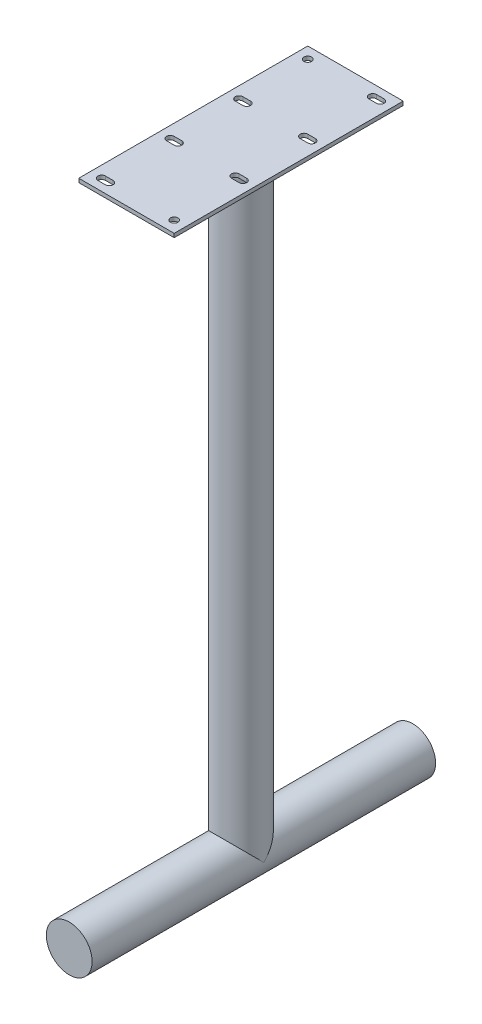
ISO-10303-21;
HEADER;
FILE_DESCRIPTION(('STEP AP214'),'2;1');
FILE_NAME('part.step','',(''),(''),'','','');
FILE_SCHEMA(('AUTOMOTIVE_DESIGN { 1 0 10303 214 1 1 1 1 }'));
ENDSEC;
DATA;
#1=APPLICATION_CONTEXT('core data for automotive mechanical design processes');
#2=APPLICATION_PROTOCOL_DEFINITION('international standard','automotive_design',2000,#1);
#3=PRODUCT_CONTEXT('',#1,'mechanical');
#4=PRODUCT('Part','Part','',(#3));
#5=PRODUCT_RELATED_PRODUCT_CATEGORY('part','',(#4));
#6=PRODUCT_DEFINITION_FORMATION('','',#4);
#7=PRODUCT_DEFINITION_CONTEXT('part definition',#1,'design');
#8=PRODUCT_DEFINITION('design','',#6,#7);
#9=PRODUCT_DEFINITION_SHAPE('','',#8);
#10=(LENGTH_UNIT() NAMED_UNIT(*) SI_UNIT(.MILLI.,.METRE.));
#11=(NAMED_UNIT(*) PLANE_ANGLE_UNIT() SI_UNIT($,.RADIAN.));
#12=(NAMED_UNIT(*) SI_UNIT($,.STERADIAN.) SOLID_ANGLE_UNIT());
#13=UNCERTAINTY_MEASURE_WITH_UNIT(LENGTH_MEASURE(1.E-05),#10,'distance_accuracy_value','');
#14=(GEOMETRIC_REPRESENTATION_CONTEXT(3) GLOBAL_UNCERTAINTY_ASSIGNED_CONTEXT((#13)) GLOBAL_UNIT_ASSIGNED_CONTEXT((#10,
#11,#12)) REPRESENTATION_CONTEXT('',''));
#15=CARTESIAN_POINT('',(0.,0.,0.));
#16=DIRECTION('',(0.,0.,1.));
#17=DIRECTION('',(1.,0.,0.));
#18=AXIS2_PLACEMENT_3D('',#15,#16,#17);
#19=CARTESIAN_POINT('',(0.,-805.,0.));
#20=DIRECTION('',(0.,1.,0.));
#21=DIRECTION('',(0.,0.,1.));
#22=AXIS2_PLACEMENT_3D('',#19,#20,#21);
#23=CYLINDRICAL_SURFACE('',#22,30.);
#24=CARTESIAN_POINT('',(0.,-5.,0.));
#25=DIRECTION('',(0.,1.,0.));
#26=DIRECTION('',(0.,0.,1.));
#27=AXIS2_PLACEMENT_3D('',#24,#25,#26);
#28=CIRCLE('',#27,30.);
#29=CARTESIAN_POINT('',(0.,-5.,30.));
#30=VERTEX_POINT('',#29);
#31=EDGE_CURVE('E11',#30,#30,#28,.F.);
#32=ORIENTED_EDGE('',*,*,#31,.T.);
#33=EDGE_LOOP('',(#32));
#34=FACE_BOUND('',#33,.T.);
#35=CARTESIAN_POINT('',(0.,-805.,0.));
#36=DIRECTION('',(0.,0.707106781186547,-0.707106781186547));
#37=DIRECTION('',(0.,0.707106781186547,0.707106781186547));
#38=AXIS2_PLACEMENT_3D('',#35,#36,#37);
#39=ELLIPSE('',#38,42.4264068711929,30.);
#40=CARTESIAN_POINT('',(30.,-805.,0.));
#41=VERTEX_POINT('',#40);
#42=CARTESIAN_POINT('',(-30.,-805.,0.));
#43=VERTEX_POINT('',#42);
#44=EDGE_CURVE('E267',#41,#43,#39,.F.);
#45=ORIENTED_EDGE('',*,*,#44,.F.);
#46=CARTESIAN_POINT('',(0.,-805.,0.));
#47=DIRECTION('',(0.,0.707106781186547,0.707106781186547));
#48=DIRECTION('',(0.,0.707106781186547,-0.707106781186547));
#49=AXIS2_PLACEMENT_3D('',#46,#47,#48);
#50=ELLIPSE('',#49,42.4264068711929,30.);
#51=EDGE_CURVE('E49',#43,#41,#50,.F.);
#52=ORIENTED_EDGE('',*,*,#51,.F.);
#53=EDGE_LOOP('',(#45,#52));
#54=FACE_BOUND('',#53,.T.);
#55=ADVANCED_FACE('F35',(#34,#54),#23,.T.);
#56=CARTESIAN_POINT('',(0.,-5.,150.));
#57=DIRECTION('',(0.,0.,1.));
#58=DIRECTION('',(1.,0.,0.));
#59=AXIS2_PLACEMENT_3D('',#56,#57,#58);
#60=PLANE('',#59);
#61=DIRECTION('',(1.,0.,0.));
#62=VECTOR('',#61,1.);
#63=CARTESIAN_POINT('',(0.,0.,150.));
#64=LINE('',#63,#62);
#65=CARTESIAN_POINT('',(-62.5,0.,150.));
#66=VERTEX_POINT('',#65);
#67=CARTESIAN_POINT('',(62.5,0.,150.));
#68=VERTEX_POINT('',#67);
#69=EDGE_CURVE('E330',#66,#68,#64,.T.);
#70=ORIENTED_EDGE('',*,*,#69,.F.);
#71=DIRECTION('',(0.,1.,0.));
#72=VECTOR('',#71,1.);
#73=CARTESIAN_POINT('',(-62.5,-5.,150.));
#74=LINE('',#73,#72);
#75=CARTESIAN_POINT('',(-62.5,-5.,150.));
#76=VERTEX_POINT('',#75);
#77=EDGE_CURVE('E43',#76,#66,#74,.T.);
#78=ORIENTED_EDGE('',*,*,#77,.F.);
#79=DIRECTION('',(1.,0.,0.));
#80=VECTOR('',#79,1.);
#81=CARTESIAN_POINT('',(0.,-5.,150.));
#82=LINE('',#81,#80);
#83=CARTESIAN_POINT('',(62.5,-5.,150.));
#84=VERTEX_POINT('',#83);
#85=EDGE_CURVE('E255',#76,#84,#82,.T.);
#86=ORIENTED_EDGE('',*,*,#85,.T.);
#87=DIRECTION('',(0.,1.,0.));
#88=VECTOR('',#87,1.);
#89=CARTESIAN_POINT('',(62.5,-5.,150.));
#90=LINE('',#89,#88);
#91=EDGE_CURVE('E252',#84,#68,#90,.T.);
#92=ORIENTED_EDGE('',*,*,#91,.T.);
#93=EDGE_LOOP('',(#70,#78,#86,#92));
#94=FACE_BOUND('',#93,.T.);
#95=ADVANCED_FACE('F484',(#94),#60,.T.);
#96=CARTESIAN_POINT('',(-62.5,-5.,0.));
#97=DIRECTION('',(1.,0.,0.));
#98=DIRECTION('',(0.,0.,-1.));
#99=AXIS2_PLACEMENT_3D('',#96,#97,#98);
#100=PLANE('',#99);
#101=DIRECTION('',(0.,0.,-1.));
#102=VECTOR('',#101,1.);
#103=CARTESIAN_POINT('',(-62.5,0.,0.));
#104=LINE('',#103,#102);
#105=CARTESIAN_POINT('',(-62.5,0.,-150.));
#106=VERTEX_POINT('',#105);
#107=EDGE_CURVE('E336',#66,#106,#104,.T.);
#108=ORIENTED_EDGE('',*,*,#107,.T.);
#109=DIRECTION('',(0.,1.,0.));
#110=VECTOR('',#109,1.);
#111=CARTESIAN_POINT('',(-62.5,-5.,-150.));
#112=LINE('',#111,#110);
#113=CARTESIAN_POINT('',(-62.5,-5.,-150.));
#114=VERTEX_POINT('',#113);
#115=EDGE_CURVE('E251',#114,#106,#112,.T.);
#116=ORIENTED_EDGE('',*,*,#115,.F.);
#117=DIRECTION('',(0.,0.,-1.));
#118=VECTOR('',#117,1.);
#119=CARTESIAN_POINT('',(-62.5,-5.,0.));
#120=LINE('',#119,#118);
#121=EDGE_CURVE('E239',#76,#114,#120,.T.);
#122=ORIENTED_EDGE('',*,*,#121,.F.);
#123=ORIENTED_EDGE('',*,*,#77,.T.);
#124=EDGE_LOOP('',(#108,#116,#122,#123));
#125=FACE_BOUND('',#124,.T.);
#126=ADVANCED_FACE('F486',(#125),#100,.F.);
#127=CARTESIAN_POINT('',(0.,-5.,-150.));
#128=DIRECTION('',(0.,0.,1.));
#129=DIRECTION('',(1.,0.,0.));
#130=AXIS2_PLACEMENT_3D('',#127,#128,#129);
#131=PLANE('',#130);
#132=DIRECTION('',(1.,0.,0.));
#133=VECTOR('',#132,1.);
#134=CARTESIAN_POINT('',(0.,0.,-150.));
#135=LINE('',#134,#133);
#136=CARTESIAN_POINT('',(62.5,0.,-150.));
#137=VERTEX_POINT('',#136);
#138=EDGE_CURVE('E247',#106,#137,#135,.T.);
#139=ORIENTED_EDGE('',*,*,#138,.T.);
#140=DIRECTION('',(0.,1.,0.));
#141=VECTOR('',#140,1.);
#142=CARTESIAN_POINT('',(62.5,-5.,-150.));
#143=LINE('',#142,#141);
#144=CARTESIAN_POINT('',(62.5,-5.,-150.));
#145=VERTEX_POINT('',#144);
#146=EDGE_CURVE('E245',#145,#137,#143,.T.);
#147=ORIENTED_EDGE('',*,*,#146,.F.);
#148=DIRECTION('',(1.,0.,0.));
#149=VECTOR('',#148,1.);
#150=CARTESIAN_POINT('',(0.,-5.,-150.));
#151=LINE('',#150,#149);
#152=EDGE_CURVE('E233',#114,#145,#151,.T.);
#153=ORIENTED_EDGE('',*,*,#152,.F.);
#154=ORIENTED_EDGE('',*,*,#115,.T.);
#155=EDGE_LOOP('',(#139,#147,#153,#154));
#156=FACE_BOUND('',#155,.T.);
#157=ADVANCED_FACE('F246',(#156),#131,.F.);
#158=CARTESIAN_POINT('',(-37.5,-5.,-45.));
#159=DIRECTION('',(0.,1.,0.));
#160=DIRECTION('',(0.,0.,1.));
#161=AXIS2_PLACEMENT_3D('',#158,#159,#160);
#162=CYLINDRICAL_SURFACE('',#161,5.);
#163=CARTESIAN_POINT('',(-37.5,0.,-45.));
#164=DIRECTION('',(0.,1.,0.));
#165=DIRECTION('',(0.,0.,1.));
#166=AXIS2_PLACEMENT_3D('',#163,#164,#165);
#167=CIRCLE('',#166,5.);
#168=CARTESIAN_POINT('',(-37.5,0.,-40.));
#169=VERTEX_POINT('',#168);
#170=CARTESIAN_POINT('',(-37.5,0.,-50.));
#171=VERTEX_POINT('',#170);
#172=EDGE_CURVE('E317',#169,#171,#167,.T.);
#173=ORIENTED_EDGE('',*,*,#172,.T.);
#174=DIRECTION('',(0.,1.,0.));
#175=VECTOR('',#174,1.);
#176=CARTESIAN_POINT('',(-37.5,-5.,-50.));
#177=LINE('',#176,#175);
#178=CARTESIAN_POINT('',(-37.5,-5.,-50.));
#179=VERTEX_POINT('',#178);
#180=EDGE_CURVE('E342',#179,#171,#177,.T.);
#181=ORIENTED_EDGE('',*,*,#180,.F.);
#182=CARTESIAN_POINT('',(-37.5,-5.,-45.));
#183=DIRECTION('',(0.,1.,0.));
#184=DIRECTION('',(0.,0.,1.));
#185=AXIS2_PLACEMENT_3D('',#182,#183,#184);
#186=CIRCLE('',#185,5.);
#187=CARTESIAN_POINT('',(-37.5,-5.,-40.));
#188=VERTEX_POINT('',#187);
#189=EDGE_CURVE('E460',#188,#179,#186,.T.);
#190=ORIENTED_EDGE('',*,*,#189,.F.);
#191=DIRECTION('',(0.,1.,0.));
#192=VECTOR('',#191,1.);
#193=CARTESIAN_POINT('',(-37.5,-5.,-40.));
#194=LINE('',#193,#192);
#195=EDGE_CURVE('E349',#188,#169,#194,.T.);
#196=ORIENTED_EDGE('',*,*,#195,.T.);
#197=EDGE_LOOP('',(#173,#181,#190,#196));
#198=FACE_BOUND('',#197,.T.);
#199=ADVANCED_FACE('F502',(#198),#162,.F.);
#200=CARTESIAN_POINT('',(0.,-5.,-50.));
#201=DIRECTION('',(0.,0.,1.));
#202=DIRECTION('',(1.,0.,0.));
#203=AXIS2_PLACEMENT_3D('',#200,#201,#202);
#204=PLANE('',#203);
#205=DIRECTION('',(1.,0.,0.));
#206=VECTOR('',#205,1.);
#207=CARTESIAN_POINT('',(0.,0.,-50.));
#208=LINE('',#207,#206);
#209=CARTESIAN_POINT('',(-47.5,0.,-50.));
#210=VERTEX_POINT('',#209);
#211=EDGE_CURVE('E324',#210,#171,#208,.T.);
#212=ORIENTED_EDGE('',*,*,#211,.F.);
#213=DIRECTION('',(0.,1.,0.));
#214=VECTOR('',#213,1.);
#215=CARTESIAN_POINT('',(-47.5,-5.,-50.));
#216=LINE('',#215,#214);
#217=CARTESIAN_POINT('',(-47.5,-5.,-50.));
#218=VERTEX_POINT('',#217);
#219=EDGE_CURVE('E344',#218,#210,#216,.T.);
#220=ORIENTED_EDGE('',*,*,#219,.F.);
#221=DIRECTION('',(1.,0.,0.));
#222=VECTOR('',#221,1.);
#223=CARTESIAN_POINT('',(0.,-5.,-50.));
#224=LINE('',#223,#222);
#225=EDGE_CURVE('E466',#218,#179,#224,.T.);
#226=ORIENTED_EDGE('',*,*,#225,.T.);
#227=ORIENTED_EDGE('',*,*,#180,.T.);
#228=EDGE_LOOP('',(#212,#220,#226,#227));
#229=FACE_BOUND('',#228,.T.);
#230=ADVANCED_FACE('F498',(#229),#204,.T.);
#231=CARTESIAN_POINT('',(-47.5,-5.,-45.));
#232=DIRECTION('',(0.,1.,0.));
#233=DIRECTION('',(0.,0.,1.));
#234=AXIS2_PLACEMENT_3D('',#231,#232,#233);
#235=CYLINDRICAL_SURFACE('',#234,5.);
#236=CARTESIAN_POINT('',(-47.5,0.,-45.));
#237=DIRECTION('',(0.,1.,0.));
#238=DIRECTION('',(0.,0.,1.));
#239=AXIS2_PLACEMENT_3D('',#236,#237,#238);
#240=CIRCLE('',#239,5.);
#241=CARTESIAN_POINT('',(-47.5,0.,-40.));
#242=VERTEX_POINT('',#241);
#243=EDGE_CURVE('E322',#210,#242,#240,.T.);
#244=ORIENTED_EDGE('',*,*,#243,.T.);
#245=DIRECTION('',(0.,1.,0.));
#246=VECTOR('',#245,1.);
#247=CARTESIAN_POINT('',(-47.5,-5.,-40.));
#248=LINE('',#247,#246);
#249=CARTESIAN_POINT('',(-47.5,-5.,-40.));
#250=VERTEX_POINT('',#249);
#251=EDGE_CURVE('E346',#250,#242,#248,.T.);
#252=ORIENTED_EDGE('',*,*,#251,.F.);
#253=CARTESIAN_POINT('',(-47.5,-5.,-45.));
#254=DIRECTION('',(0.,1.,0.));
#255=DIRECTION('',(0.,0.,1.));
#256=AXIS2_PLACEMENT_3D('',#253,#254,#255);
#257=CIRCLE('',#256,5.);
#258=EDGE_CURVE('E464',#218,#250,#257,.T.);
#259=ORIENTED_EDGE('',*,*,#258,.F.);
#260=ORIENTED_EDGE('',*,*,#219,.T.);
#261=EDGE_LOOP('',(#244,#252,#259,#260));
#262=FACE_BOUND('',#261,.T.);
#263=ADVANCED_FACE('F501',(#262),#235,.F.);
#264=CARTESIAN_POINT('',(-37.5,-5.,45.));
#265=DIRECTION('',(0.,1.,0.));
#266=DIRECTION('',(0.,0.,1.));
#267=AXIS2_PLACEMENT_3D('',#264,#265,#266);
#268=CYLINDRICAL_SURFACE('',#267,5.);
#269=CARTESIAN_POINT('',(-37.5,0.,45.));
#270=DIRECTION('',(0.,1.,0.));
#271=DIRECTION('',(0.,0.,1.));
#272=AXIS2_PLACEMENT_3D('',#269,#270,#271);
#273=CIRCLE('',#272,5.);
#274=CARTESIAN_POINT('',(-37.5,0.,50.));
#275=VERTEX_POINT('',#274);
#276=CARTESIAN_POINT('',(-37.5,0.,40.));
#277=VERTEX_POINT('',#276);
#278=EDGE_CURVE('E307',#275,#277,#273,.T.);
#279=ORIENTED_EDGE('',*,*,#278,.T.);
#280=DIRECTION('',(0.,1.,0.));
#281=VECTOR('',#280,1.);
#282=CARTESIAN_POINT('',(-37.5,-5.,40.));
#283=LINE('',#282,#281);
#284=CARTESIAN_POINT('',(-37.5,-5.,40.));
#285=VERTEX_POINT('',#284);
#286=EDGE_CURVE('E352',#285,#277,#283,.T.);
#287=ORIENTED_EDGE('',*,*,#286,.F.);
#288=CARTESIAN_POINT('',(-37.5,-5.,45.));
#289=DIRECTION('',(0.,1.,0.));
#290=DIRECTION('',(0.,0.,1.));
#291=AXIS2_PLACEMENT_3D('',#288,#289,#290);
#292=CIRCLE('',#291,5.);
#293=CARTESIAN_POINT('',(-37.5,-5.,50.));
#294=VERTEX_POINT('',#293);
#295=EDGE_CURVE('E451',#294,#285,#292,.T.);
#296=ORIENTED_EDGE('',*,*,#295,.F.);
#297=DIRECTION('',(0.,1.,0.));
#298=VECTOR('',#297,1.);
#299=CARTESIAN_POINT('',(-37.5,-5.,50.));
#300=LINE('',#299,#298);
#301=EDGE_CURVE('E359',#294,#275,#300,.T.);
#302=ORIENTED_EDGE('',*,*,#301,.T.);
#303=EDGE_LOOP('',(#279,#287,#296,#302));
#304=FACE_BOUND('',#303,.T.);
#305=ADVANCED_FACE('F506',(#304),#268,.F.);
#306=CARTESIAN_POINT('',(0.,-5.,40.));
#307=DIRECTION('',(0.,0.,1.));
#308=DIRECTION('',(1.,0.,0.));
#309=AXIS2_PLACEMENT_3D('',#306,#307,#308);
#310=PLANE('',#309);
#311=DIRECTION('',(1.,0.,0.));
#312=VECTOR('',#311,1.);
#313=CARTESIAN_POINT('',(0.,0.,40.));
#314=LINE('',#313,#312);
#315=CARTESIAN_POINT('',(-47.5,0.,40.));
#316=VERTEX_POINT('',#315);
#317=EDGE_CURVE('E314',#316,#277,#314,.T.);
#318=ORIENTED_EDGE('',*,*,#317,.F.);
#319=DIRECTION('',(0.,1.,0.));
#320=VECTOR('',#319,1.);
#321=CARTESIAN_POINT('',(-47.5,-5.,40.));
#322=LINE('',#321,#320);
#323=CARTESIAN_POINT('',(-47.5,-5.,40.));
#324=VERTEX_POINT('',#323);
#325=EDGE_CURVE('E354',#324,#316,#322,.T.);
#326=ORIENTED_EDGE('',*,*,#325,.F.);
#327=DIRECTION('',(1.,0.,0.));
#328=VECTOR('',#327,1.);
#329=CARTESIAN_POINT('',(0.,-5.,40.));
#330=LINE('',#329,#328);
#331=EDGE_CURVE('E457',#324,#285,#330,.T.);
#332=ORIENTED_EDGE('',*,*,#331,.T.);
#333=ORIENTED_EDGE('',*,*,#286,.T.);
#334=EDGE_LOOP('',(#318,#326,#332,#333));
#335=FACE_BOUND('',#334,.T.);
#336=ADVANCED_FACE('F515',(#335),#310,.T.);
#337=CARTESIAN_POINT('',(-47.5,-5.,45.));
#338=DIRECTION('',(0.,1.,0.));
#339=DIRECTION('',(0.,0.,1.));
#340=AXIS2_PLACEMENT_3D('',#337,#338,#339);
#341=CYLINDRICAL_SURFACE('',#340,4.99999999999999);
#342=CARTESIAN_POINT('',(-47.5,0.,45.));
#343=DIRECTION('',(0.,1.,0.));
#344=DIRECTION('',(0.,0.,1.));
#345=AXIS2_PLACEMENT_3D('',#342,#343,#344);
#346=CIRCLE('',#345,4.99999999999999);
#347=CARTESIAN_POINT('',(-47.5,0.,50.));
#348=VERTEX_POINT('',#347);
#349=EDGE_CURVE('E312',#316,#348,#346,.T.);
#350=ORIENTED_EDGE('',*,*,#349,.T.);
#351=DIRECTION('',(0.,1.,0.));
#352=VECTOR('',#351,1.);
#353=CARTESIAN_POINT('',(-47.5,-5.,50.));
#354=LINE('',#353,#352);
#355=CARTESIAN_POINT('',(-47.5,-5.,50.));
#356=VERTEX_POINT('',#355);
#357=EDGE_CURVE('E356',#356,#348,#354,.T.);
#358=ORIENTED_EDGE('',*,*,#357,.F.);
#359=CARTESIAN_POINT('',(-47.5,-5.,45.));
#360=DIRECTION('',(0.,1.,0.));
#361=DIRECTION('',(0.,0.,1.));
#362=AXIS2_PLACEMENT_3D('',#359,#360,#361);
#363=CIRCLE('',#362,4.99999999999999);
#364=EDGE_CURVE('E455',#324,#356,#363,.T.);
#365=ORIENTED_EDGE('',*,*,#364,.F.);
#366=ORIENTED_EDGE('',*,*,#325,.T.);
#367=EDGE_LOOP('',(#350,#358,#365,#366));
#368=FACE_BOUND('',#367,.T.);
#369=ADVANCED_FACE('F518',(#368),#341,.F.);
#370=CARTESIAN_POINT('',(-37.5,-5.,135.));
#371=DIRECTION('',(0.,1.,0.));
#372=DIRECTION('',(0.,0.,1.));
#373=AXIS2_PLACEMENT_3D('',#370,#371,#372);
#374=CYLINDRICAL_SURFACE('',#373,5.);
#375=CARTESIAN_POINT('',(-37.5,0.,135.));
#376=DIRECTION('',(0.,1.,0.));
#377=DIRECTION('',(0.,0.,1.));
#378=AXIS2_PLACEMENT_3D('',#375,#376,#377);
#379=CIRCLE('',#378,5.);
#380=CARTESIAN_POINT('',(-37.5,0.,140.));
#381=VERTEX_POINT('',#380);
#382=CARTESIAN_POINT('',(-37.5,0.,130.));
#383=VERTEX_POINT('',#382);
#384=EDGE_CURVE('E297',#381,#383,#379,.T.);
#385=ORIENTED_EDGE('',*,*,#384,.T.);
#386=DIRECTION('',(0.,1.,0.));
#387=VECTOR('',#386,1.);
#388=CARTESIAN_POINT('',(-37.5,-5.,130.));
#389=LINE('',#388,#387);
#390=CARTESIAN_POINT('',(-37.5,-5.,130.));
#391=VERTEX_POINT('',#390);
#392=EDGE_CURVE('E362',#391,#383,#389,.T.);
#393=ORIENTED_EDGE('',*,*,#392,.F.);
#394=CARTESIAN_POINT('',(-37.5,-5.,135.));
#395=DIRECTION('',(0.,1.,0.));
#396=DIRECTION('',(0.,0.,1.));
#397=AXIS2_PLACEMENT_3D('',#394,#395,#396);
#398=CIRCLE('',#397,5.);
#399=CARTESIAN_POINT('',(-37.5,-5.,140.));
#400=VERTEX_POINT('',#399);
#401=EDGE_CURVE('E442',#400,#391,#398,.T.);
#402=ORIENTED_EDGE('',*,*,#401,.F.);
#403=DIRECTION('',(0.,1.,0.));
#404=VECTOR('',#403,1.);
#405=CARTESIAN_POINT('',(-37.5,-5.,140.));
#406=LINE('',#405,#404);
#407=EDGE_CURVE('E369',#400,#381,#406,.T.);
#408=ORIENTED_EDGE('',*,*,#407,.T.);
#409=EDGE_LOOP('',(#385,#393,#402,#408));
#410=FACE_BOUND('',#409,.T.);
#411=ADVANCED_FACE('F522',(#410),#374,.F.);
#412=CARTESIAN_POINT('',(0.,-5.,130.));
#413=DIRECTION('',(0.,0.,1.));
#414=DIRECTION('',(1.,0.,0.));
#415=AXIS2_PLACEMENT_3D('',#412,#413,#414);
#416=PLANE('',#415);
#417=DIRECTION('',(1.,0.,0.));
#418=VECTOR('',#417,1.);
#419=CARTESIAN_POINT('',(0.,0.,130.));
#420=LINE('',#419,#418);
#421=CARTESIAN_POINT('',(-47.5,0.,130.));
#422=VERTEX_POINT('',#421);
#423=EDGE_CURVE('E304',#422,#383,#420,.T.);
#424=ORIENTED_EDGE('',*,*,#423,.F.);
#425=DIRECTION('',(0.,1.,0.));
#426=VECTOR('',#425,1.);
#427=CARTESIAN_POINT('',(-47.5,-5.,130.));
#428=LINE('',#427,#426);
#429=CARTESIAN_POINT('',(-47.5,-5.,130.));
#430=VERTEX_POINT('',#429);
#431=EDGE_CURVE('E364',#430,#422,#428,.T.);
#432=ORIENTED_EDGE('',*,*,#431,.F.);
#433=DIRECTION('',(1.,0.,0.));
#434=VECTOR('',#433,1.);
#435=CARTESIAN_POINT('',(0.,-5.,130.));
#436=LINE('',#435,#434);
#437=EDGE_CURVE('E448',#430,#391,#436,.T.);
#438=ORIENTED_EDGE('',*,*,#437,.T.);
#439=ORIENTED_EDGE('',*,*,#392,.T.);
#440=EDGE_LOOP('',(#424,#432,#438,#439));
#441=FACE_BOUND('',#440,.T.);
#442=ADVANCED_FACE('F531',(#441),#416,.T.);
#443=CARTESIAN_POINT('',(-47.5,-5.,135.));
#444=DIRECTION('',(0.,1.,0.));
#445=DIRECTION('',(0.,0.,1.));
#446=AXIS2_PLACEMENT_3D('',#443,#444,#445);
#447=CYLINDRICAL_SURFACE('',#446,5.);
#448=CARTESIAN_POINT('',(-47.5,0.,135.));
#449=DIRECTION('',(0.,1.,0.));
#450=DIRECTION('',(0.,0.,1.));
#451=AXIS2_PLACEMENT_3D('',#448,#449,#450);
#452=CIRCLE('',#451,5.);
#453=CARTESIAN_POINT('',(-47.5,0.,140.));
#454=VERTEX_POINT('',#453);
#455=EDGE_CURVE('E302',#422,#454,#452,.T.);
#456=ORIENTED_EDGE('',*,*,#455,.T.);
#457=DIRECTION('',(0.,1.,0.));
#458=VECTOR('',#457,1.);
#459=CARTESIAN_POINT('',(-47.5,-5.,140.));
#460=LINE('',#459,#458);
#461=CARTESIAN_POINT('',(-47.5,-5.,140.));
#462=VERTEX_POINT('',#461);
#463=EDGE_CURVE('E366',#462,#454,#460,.T.);
#464=ORIENTED_EDGE('',*,*,#463,.F.);
#465=CARTESIAN_POINT('',(-47.5,-5.,135.));
#466=DIRECTION('',(0.,1.,0.));
#467=DIRECTION('',(0.,0.,1.));
#468=AXIS2_PLACEMENT_3D('',#465,#466,#467);
#469=CIRCLE('',#468,5.);
#470=EDGE_CURVE('E446',#430,#462,#469,.T.);
#471=ORIENTED_EDGE('',*,*,#470,.F.);
#472=ORIENTED_EDGE('',*,*,#431,.T.);
#473=EDGE_LOOP('',(#456,#464,#471,#472));
#474=FACE_BOUND('',#473,.T.);
#475=ADVANCED_FACE('F534',(#474),#447,.F.);
#476=CARTESIAN_POINT('',(37.5,-5.,45.));
#477=DIRECTION('',(0.,1.,0.));
#478=DIRECTION('',(0.,0.,1.));
#479=AXIS2_PLACEMENT_3D('',#476,#477,#478);
#480=CYLINDRICAL_SURFACE('',#479,4.99999999999999);
#481=CARTESIAN_POINT('',(37.5,0.,45.));
#482=DIRECTION('',(0.,1.,0.));
#483=DIRECTION('',(0.,0.,1.));
#484=AXIS2_PLACEMENT_3D('',#481,#482,#483);
#485=CIRCLE('',#484,4.99999999999999);
#486=CARTESIAN_POINT('',(37.5,0.,40.));
#487=VERTEX_POINT('',#486);
#488=CARTESIAN_POINT('',(37.4999999999999,0.,50.));
#489=VERTEX_POINT('',#488);
#490=EDGE_CURVE('E284',#487,#489,#485,.T.);
#491=ORIENTED_EDGE('',*,*,#490,.T.);
#492=DIRECTION('',(0.,1.,0.));
#493=VECTOR('',#492,1.);
#494=CARTESIAN_POINT('',(37.4999999999999,-5.,50.));
#495=LINE('',#494,#493);
#496=CARTESIAN_POINT('',(37.4999999999999,-5.,50.));
#497=VERTEX_POINT('',#496);
#498=EDGE_CURVE('E372',#497,#489,#495,.T.);
#499=ORIENTED_EDGE('',*,*,#498,.F.);
#500=CARTESIAN_POINT('',(37.5,-5.,45.));
#501=DIRECTION('',(0.,1.,0.));
#502=DIRECTION('',(0.,0.,1.));
#503=AXIS2_PLACEMENT_3D('',#500,#501,#502);
#504=CIRCLE('',#503,4.99999999999999);
#505=CARTESIAN_POINT('',(37.5,-5.,40.));
#506=VERTEX_POINT('',#505);
#507=EDGE_CURVE('E430',#506,#497,#504,.T.);
#508=ORIENTED_EDGE('',*,*,#507,.F.);
#509=DIRECTION('',(0.,1.,0.));
#510=VECTOR('',#509,1.);
#511=CARTESIAN_POINT('',(37.5,-5.,40.));
#512=LINE('',#511,#510);
#513=EDGE_CURVE('E379',#506,#487,#512,.T.);
#514=ORIENTED_EDGE('',*,*,#513,.T.);
#515=EDGE_LOOP('',(#491,#499,#508,#514));
#516=FACE_BOUND('',#515,.T.);
#517=ADVANCED_FACE('F538',(#516),#480,.F.);
#518=CARTESIAN_POINT('',(-1.04083408558608E-13,-5.,50.));
#519=DIRECTION('',(0.,0.,-1.));
#520=DIRECTION('',(-1.,0.,0.));
#521=AXIS2_PLACEMENT_3D('',#518,#519,#520);
#522=PLANE('',#521);
#523=DIRECTION('',(-1.,0.,0.));
#524=VECTOR('',#523,1.);
#525=CARTESIAN_POINT('',(-1.04083408558608E-13,0.,50.));
#526=LINE('',#525,#524);
#527=CARTESIAN_POINT('',(47.4999999999999,0.,50.));
#528=VERTEX_POINT('',#527);
#529=EDGE_CURVE('E291',#528,#489,#526,.T.);
#530=ORIENTED_EDGE('',*,*,#529,.F.);
#531=DIRECTION('',(0.,1.,0.));
#532=VECTOR('',#531,1.);
#533=CARTESIAN_POINT('',(47.4999999999999,-5.,50.));
#534=LINE('',#533,#532);
#535=CARTESIAN_POINT('',(47.4999999999999,-5.,50.));
#536=VERTEX_POINT('',#535);
#537=EDGE_CURVE('E374',#536,#528,#534,.T.);
#538=ORIENTED_EDGE('',*,*,#537,.F.);
#539=DIRECTION('',(-1.,0.,0.));
#540=VECTOR('',#539,1.);
#541=CARTESIAN_POINT('',(-1.04083408558608E-13,-5.,50.));
#542=LINE('',#541,#540);
#543=EDGE_CURVE('E436',#536,#497,#542,.T.);
#544=ORIENTED_EDGE('',*,*,#543,.T.);
#545=ORIENTED_EDGE('',*,*,#498,.T.);
#546=EDGE_LOOP('',(#530,#538,#544,#545));
#547=FACE_BOUND('',#546,.T.);
#548=ADVANCED_FACE('F551',(#547),#522,.T.);
#549=CARTESIAN_POINT('',(47.5,-5.,45.));
#550=DIRECTION('',(0.,1.,0.));
#551=DIRECTION('',(0.,0.,1.));
#552=AXIS2_PLACEMENT_3D('',#549,#550,#551);
#553=CYLINDRICAL_SURFACE('',#552,5.);
#554=CARTESIAN_POINT('',(47.5,0.,45.));
#555=DIRECTION('',(0.,1.,0.));
#556=DIRECTION('',(0.,0.,1.));
#557=AXIS2_PLACEMENT_3D('',#554,#555,#556);
#558=CIRCLE('',#557,5.);
#559=CARTESIAN_POINT('',(47.5,0.,40.));
#560=VERTEX_POINT('',#559);
#561=EDGE_CURVE('E289',#528,#560,#558,.T.);
#562=ORIENTED_EDGE('',*,*,#561,.T.);
#563=DIRECTION('',(0.,1.,0.));
#564=VECTOR('',#563,1.);
#565=CARTESIAN_POINT('',(47.5,-5.,40.));
#566=LINE('',#565,#564);
#567=CARTESIAN_POINT('',(47.5,-5.,40.));
#568=VERTEX_POINT('',#567);
#569=EDGE_CURVE('E376',#568,#560,#566,.T.);
#570=ORIENTED_EDGE('',*,*,#569,.F.);
#571=CARTESIAN_POINT('',(47.5,-5.,45.));
#572=DIRECTION('',(0.,1.,0.));
#573=DIRECTION('',(0.,0.,1.));
#574=AXIS2_PLACEMENT_3D('',#571,#572,#573);
#575=CIRCLE('',#574,5.);
#576=EDGE_CURVE('E434',#536,#568,#575,.T.);
#577=ORIENTED_EDGE('',*,*,#576,.F.);
#578=ORIENTED_EDGE('',*,*,#537,.T.);
#579=EDGE_LOOP('',(#562,#570,#577,#578));
#580=FACE_BOUND('',#579,.T.);
#581=ADVANCED_FACE('F554',(#580),#553,.F.);
#582=CARTESIAN_POINT('',(37.5,-5.,-45.));
#583=DIRECTION('',(0.,1.,0.));
#584=DIRECTION('',(0.,0.,1.));
#585=AXIS2_PLACEMENT_3D('',#582,#583,#584);
#586=CYLINDRICAL_SURFACE('',#585,4.99999999999999);
#587=CARTESIAN_POINT('',(37.5,0.,-45.));
#588=DIRECTION('',(0.,1.,0.));
#589=DIRECTION('',(0.,0.,1.));
#590=AXIS2_PLACEMENT_3D('',#587,#588,#589);
#591=CIRCLE('',#590,4.99999999999999);
#592=CARTESIAN_POINT('',(37.5,0.,-50.));
#593=VERTEX_POINT('',#592);
#594=CARTESIAN_POINT('',(37.5,0.,-40.));
#595=VERTEX_POINT('',#594);
#596=EDGE_CURVE('E274',#593,#595,#591,.T.);
#597=ORIENTED_EDGE('',*,*,#596,.T.);
#598=DIRECTION('',(0.,1.,0.));
#599=VECTOR('',#598,1.);
#600=CARTESIAN_POINT('',(37.5,-5.,-40.));
#601=LINE('',#600,#599);
#602=CARTESIAN_POINT('',(37.5,-5.,-40.));
#603=VERTEX_POINT('',#602);
#604=EDGE_CURVE('E382',#603,#595,#601,.T.);
#605=ORIENTED_EDGE('',*,*,#604,.F.);
#606=CARTESIAN_POINT('',(37.5,-5.,-45.));
#607=DIRECTION('',(0.,1.,0.));
#608=DIRECTION('',(0.,0.,1.));
#609=AXIS2_PLACEMENT_3D('',#606,#607,#608);
#610=CIRCLE('',#609,4.99999999999999);
#611=CARTESIAN_POINT('',(37.5,-5.,-50.));
#612=VERTEX_POINT('',#611);
#613=EDGE_CURVE('E416',#612,#603,#610,.T.);
#614=ORIENTED_EDGE('',*,*,#613,.F.);
#615=DIRECTION('',(0.,1.,0.));
#616=VECTOR('',#615,1.);
#617=CARTESIAN_POINT('',(37.5,-5.,-50.));
#618=LINE('',#617,#616);
#619=EDGE_CURVE('E389',#612,#593,#618,.T.);
#620=ORIENTED_EDGE('',*,*,#619,.T.);
#621=EDGE_LOOP('',(#597,#605,#614,#620));
#622=FACE_BOUND('',#621,.T.);
#623=ADVANCED_FACE('F558',(#622),#586,.F.);
#624=CARTESIAN_POINT('',(0.,-5.,-40.));
#625=DIRECTION('',(0.,0.,-1.));
#626=DIRECTION('',(-1.,0.,0.));
#627=AXIS2_PLACEMENT_3D('',#624,#625,#626);
#628=PLANE('',#627);
#629=DIRECTION('',(-1.,0.,0.));
#630=VECTOR('',#629,1.);
#631=CARTESIAN_POINT('',(0.,0.,-40.));
#632=LINE('',#631,#630);
#633=CARTESIAN_POINT('',(47.5,0.,-40.));
#634=VERTEX_POINT('',#633);
#635=EDGE_CURVE('E281',#634,#595,#632,.T.);
#636=ORIENTED_EDGE('',*,*,#635,.F.);
#637=DIRECTION('',(0.,1.,0.));
#638=VECTOR('',#637,1.);
#639=CARTESIAN_POINT('',(47.5,-5.,-40.));
#640=LINE('',#639,#638);
#641=CARTESIAN_POINT('',(47.5,-5.,-40.));
#642=VERTEX_POINT('',#641);
#643=EDGE_CURVE('E384',#642,#634,#640,.T.);
#644=ORIENTED_EDGE('',*,*,#643,.F.);
#645=DIRECTION('',(-1.,0.,0.));
#646=VECTOR('',#645,1.);
#647=CARTESIAN_POINT('',(0.,-5.,-40.));
#648=LINE('',#647,#646);
#649=EDGE_CURVE('E427',#642,#603,#648,.T.);
#650=ORIENTED_EDGE('',*,*,#649,.T.);
#651=ORIENTED_EDGE('',*,*,#604,.T.);
#652=EDGE_LOOP('',(#636,#644,#650,#651));
#653=FACE_BOUND('',#652,.T.);
#654=ADVANCED_FACE('F567',(#653),#628,.T.);
#655=CARTESIAN_POINT('',(47.5,-5.,-45.));
#656=DIRECTION('',(0.,1.,0.));
#657=DIRECTION('',(0.,0.,1.));
#658=AXIS2_PLACEMENT_3D('',#655,#656,#657);
#659=CYLINDRICAL_SURFACE('',#658,5.);
#660=CARTESIAN_POINT('',(47.5,0.,-45.));
#661=DIRECTION('',(0.,1.,0.));
#662=DIRECTION('',(0.,0.,1.));
#663=AXIS2_PLACEMENT_3D('',#660,#661,#662);
#664=CIRCLE('',#663,5.);
#665=CARTESIAN_POINT('',(47.5,0.,-50.));
#666=VERTEX_POINT('',#665);
#667=EDGE_CURVE('E279',#634,#666,#664,.T.);
#668=ORIENTED_EDGE('',*,*,#667,.T.);
#669=DIRECTION('',(0.,1.,0.));
#670=VECTOR('',#669,1.);
#671=CARTESIAN_POINT('',(47.5,-5.,-50.));
#672=LINE('',#671,#670);
#673=CARTESIAN_POINT('',(47.5,-5.,-50.));
#674=VERTEX_POINT('',#673);
#675=EDGE_CURVE('E386',#674,#666,#672,.T.);
#676=ORIENTED_EDGE('',*,*,#675,.F.);
#677=CARTESIAN_POINT('',(47.5,-5.,-45.));
#678=DIRECTION('',(0.,1.,0.));
#679=DIRECTION('',(0.,0.,1.));
#680=AXIS2_PLACEMENT_3D('',#677,#678,#679);
#681=CIRCLE('',#680,5.);
#682=EDGE_CURVE('E425',#642,#674,#681,.T.);
#683=ORIENTED_EDGE('',*,*,#682,.F.);
#684=ORIENTED_EDGE('',*,*,#643,.T.);
#685=EDGE_LOOP('',(#668,#676,#683,#684));
#686=FACE_BOUND('',#685,.T.);
#687=ADVANCED_FACE('F570',(#686),#659,.F.);
#688=CARTESIAN_POINT('',(37.5000000000001,-5.,-135.));
#689=DIRECTION('',(0.,1.,0.));
#690=DIRECTION('',(0.,0.,1.));
#691=AXIS2_PLACEMENT_3D('',#688,#689,#690);
#692=CYLINDRICAL_SURFACE('',#691,5.00000000000002);
#693=CARTESIAN_POINT('',(37.5000000000001,0.,-135.));
#694=DIRECTION('',(0.,1.,0.));
#695=DIRECTION('',(0.,0.,1.));
#696=AXIS2_PLACEMENT_3D('',#693,#694,#695);
#697=CIRCLE('',#696,5.00000000000002);
#698=CARTESIAN_POINT('',(37.5000000000001,0.,-140.));
#699=VERTEX_POINT('',#698);
#700=CARTESIAN_POINT('',(37.5000000000001,0.,-130.));
#701=VERTEX_POINT('',#700);
#702=EDGE_CURVE('E263',#699,#701,#697,.T.);
#703=ORIENTED_EDGE('',*,*,#702,.T.);
#704=DIRECTION('',(0.,1.,0.));
#705=VECTOR('',#704,1.);
#706=CARTESIAN_POINT('',(37.5000000000001,-5.,-130.));
#707=LINE('',#706,#705);
#708=CARTESIAN_POINT('',(37.5000000000001,-5.,-130.));
#709=VERTEX_POINT('',#708);
#710=EDGE_CURVE('E392',#709,#701,#707,.T.);
#711=ORIENTED_EDGE('',*,*,#710,.F.);
#712=CARTESIAN_POINT('',(37.5000000000001,-5.,-135.));
#713=DIRECTION('',(0.,1.,0.));
#714=DIRECTION('',(0.,0.,1.));
#715=AXIS2_PLACEMENT_3D('',#712,#713,#714);
#716=CIRCLE('',#715,5.00000000000002);
#717=CARTESIAN_POINT('',(37.5000000000001,-5.,-140.));
#718=VERTEX_POINT('',#717);
#719=EDGE_CURVE('E338',#718,#709,#716,.T.);
#720=ORIENTED_EDGE('',*,*,#719,.F.);
#721=DIRECTION('',(0.,1.,0.));
#722=VECTOR('',#721,1.);
#723=CARTESIAN_POINT('',(37.5000000000001,-5.,-140.));
#724=LINE('',#723,#722);
#725=EDGE_CURVE('E262',#718,#699,#724,.T.);
#726=ORIENTED_EDGE('',*,*,#725,.T.);
#727=EDGE_LOOP('',(#703,#711,#720,#726));
#728=FACE_BOUND('',#727,.T.);
#729=ADVANCED_FACE('F37',(#728),#692,.F.);
#730=CARTESIAN_POINT('',(3.60822483003176E-13,-5.,-130.));
#731=DIRECTION('',(0.,0.,-1.));
#732=DIRECTION('',(-1.,0.,0.));
#733=AXIS2_PLACEMENT_3D('',#730,#731,#732);
#734=PLANE('',#733);
#735=DIRECTION('',(-1.,0.,0.));
#736=VECTOR('',#735,1.);
#737=CARTESIAN_POINT('',(3.60822483003176E-13,0.,-130.));
#738=LINE('',#737,#736);
#739=CARTESIAN_POINT('',(47.5000000000001,0.,-130.));
#740=VERTEX_POINT('',#739);
#741=EDGE_CURVE('E271',#740,#701,#738,.T.);
#742=ORIENTED_EDGE('',*,*,#741,.F.);
#743=DIRECTION('',(0.,1.,0.));
#744=VECTOR('',#743,1.);
#745=CARTESIAN_POINT('',(47.5000000000001,-5.,-130.));
#746=LINE('',#745,#744);
#747=CARTESIAN_POINT('',(47.5000000000001,-5.,-130.));
#748=VERTEX_POINT('',#747);
#749=EDGE_CURVE('E394',#748,#740,#746,.T.);
#750=ORIENTED_EDGE('',*,*,#749,.F.);
#751=DIRECTION('',(-1.,0.,0.));
#752=VECTOR('',#751,1.);
#753=CARTESIAN_POINT('',(3.60822483003176E-13,-5.,-130.));
#754=LINE('',#753,#752);
#755=EDGE_CURVE('E415',#748,#709,#754,.T.);
#756=ORIENTED_EDGE('',*,*,#755,.T.);
#757=ORIENTED_EDGE('',*,*,#710,.T.);
#758=EDGE_LOOP('',(#742,#750,#756,#757));
#759=FACE_BOUND('',#758,.T.);
#760=ADVANCED_FACE('F411',(#759),#734,.T.);
#761=CARTESIAN_POINT('',(47.5000000000001,-5.,-135.));
#762=DIRECTION('',(0.,1.,0.));
#763=DIRECTION('',(0.,0.,1.));
#764=AXIS2_PLACEMENT_3D('',#761,#762,#763);
#765=CYLINDRICAL_SURFACE('',#764,5.00000000000003);
#766=CARTESIAN_POINT('',(47.5000000000001,0.,-135.));
#767=DIRECTION('',(0.,1.,0.));
#768=DIRECTION('',(0.,0.,1.));
#769=AXIS2_PLACEMENT_3D('',#766,#767,#768);
#770=CIRCLE('',#769,5.00000000000003);
#771=CARTESIAN_POINT('',(47.5000000000001,0.,-140.));
#772=VERTEX_POINT('',#771);
#773=EDGE_CURVE('E269',#740,#772,#770,.T.);
#774=ORIENTED_EDGE('',*,*,#773,.T.);
#775=DIRECTION('',(0.,1.,0.));
#776=VECTOR('',#775,1.);
#777=CARTESIAN_POINT('',(47.5000000000001,-5.,-140.));
#778=LINE('',#777,#776);
#779=CARTESIAN_POINT('',(47.5000000000001,-5.,-140.));
#780=VERTEX_POINT('',#779);
#781=EDGE_CURVE('E396',#780,#772,#778,.T.);
#782=ORIENTED_EDGE('',*,*,#781,.F.);
#783=CARTESIAN_POINT('',(47.5000000000001,-5.,-135.));
#784=DIRECTION('',(0.,1.,0.));
#785=DIRECTION('',(0.,0.,1.));
#786=AXIS2_PLACEMENT_3D('',#783,#784,#785);
#787=CIRCLE('',#786,5.00000000000003);
#788=EDGE_CURVE('E417',#748,#780,#787,.T.);
#789=ORIENTED_EDGE('',*,*,#788,.F.);
#790=ORIENTED_EDGE('',*,*,#749,.T.);
#791=EDGE_LOOP('',(#774,#782,#789,#790));
#792=FACE_BOUND('',#791,.T.);
#793=ADVANCED_FACE('F476',(#792),#765,.F.);
#794=CARTESIAN_POINT('',(-47.5000000000001,-5.,-135.));
#795=DIRECTION('',(0.,1.,0.));
#796=DIRECTION('',(0.,0.,1.));
#797=AXIS2_PLACEMENT_3D('',#794,#795,#796);
#798=CYLINDRICAL_SURFACE('',#797,5.);
#799=CARTESIAN_POINT('',(-47.5000000000001,-5.,-135.));
#800=DIRECTION('',(0.,1.,0.));
#801=DIRECTION('',(0.,0.,1.));
#802=AXIS2_PLACEMENT_3D('',#799,#800,#801);
#803=CIRCLE('',#802,5.);
#804=CARTESIAN_POINT('',(-47.5000000000001,-5.,-130.));
#805=VERTEX_POINT('',#804);
#806=EDGE_CURVE('E257',#805,#805,#803,.T.);
#807=ORIENTED_EDGE('',*,*,#806,.F.);
#808=EDGE_LOOP('',(#807));
#809=FACE_BOUND('',#808,.T.);
#810=CARTESIAN_POINT('',(-47.5000000000001,0.,-135.));
#811=DIRECTION('',(0.,1.,0.));
#812=DIRECTION('',(0.,0.,1.));
#813=AXIS2_PLACEMENT_3D('',#810,#811,#812);
#814=CIRCLE('',#813,5.);
#815=CARTESIAN_POINT('',(-47.5000000000001,0.,-130.));
#816=VERTEX_POINT('',#815);
#817=EDGE_CURVE('E327',#816,#816,#814,.T.);
#818=ORIENTED_EDGE('',*,*,#817,.T.);
#819=EDGE_LOOP('',(#818));
#820=FACE_BOUND('',#819,.T.);
#821=ADVANCED_FACE('F472',(#809,#820),#798,.F.);
#822=CARTESIAN_POINT('',(0.,-5.,-40.));
#823=DIRECTION('',(0.,0.,1.));
#824=DIRECTION('',(1.,0.,0.));
#825=AXIS2_PLACEMENT_3D('',#822,#823,#824);
#826=PLANE('',#825);
#827=DIRECTION('',(1.,0.,0.));
#828=VECTOR('',#827,1.);
#829=CARTESIAN_POINT('',(0.,0.,-40.));
#830=LINE('',#829,#828);
#831=EDGE_CURVE('E320',#242,#169,#830,.T.);
#832=ORIENTED_EDGE('',*,*,#831,.T.);
#833=ORIENTED_EDGE('',*,*,#195,.F.);
#834=DIRECTION('',(1.,0.,0.));
#835=VECTOR('',#834,1.);
#836=CARTESIAN_POINT('',(0.,-5.,-40.));
#837=LINE('',#836,#835);
#838=EDGE_CURVE('E462',#250,#188,#837,.T.);
#839=ORIENTED_EDGE('',*,*,#838,.F.);
#840=ORIENTED_EDGE('',*,*,#251,.T.);
#841=EDGE_LOOP('',(#832,#833,#839,#840));
#842=FACE_BOUND('',#841,.T.);
#843=ADVANCED_FACE('F475',(#842),#826,.F.);
#844=CARTESIAN_POINT('',(0.,-5.,50.));
#845=DIRECTION('',(0.,0.,1.));
#846=DIRECTION('',(1.,0.,0.));
#847=AXIS2_PLACEMENT_3D('',#844,#845,#846);
#848=PLANE('',#847);
#849=DIRECTION('',(1.,0.,0.));
#850=VECTOR('',#849,1.);
#851=CARTESIAN_POINT('',(0.,0.,50.));
#852=LINE('',#851,#850);
#853=EDGE_CURVE('E310',#348,#275,#852,.T.);
#854=ORIENTED_EDGE('',*,*,#853,.T.);
#855=ORIENTED_EDGE('',*,*,#301,.F.);
#856=DIRECTION('',(1.,0.,0.));
#857=VECTOR('',#856,1.);
#858=CARTESIAN_POINT('',(0.,-5.,50.));
#859=LINE('',#858,#857);
#860=EDGE_CURVE('E453',#356,#294,#859,.T.);
#861=ORIENTED_EDGE('',*,*,#860,.F.);
#862=ORIENTED_EDGE('',*,*,#357,.T.);
#863=EDGE_LOOP('',(#854,#855,#861,#862));
#864=FACE_BOUND('',#863,.T.);
#865=ADVANCED_FACE('F510',(#864),#848,.F.);
#866=CARTESIAN_POINT('',(0.,-5.,140.));
#867=DIRECTION('',(0.,0.,1.));
#868=DIRECTION('',(1.,0.,0.));
#869=AXIS2_PLACEMENT_3D('',#866,#867,#868);
#870=PLANE('',#869);
#871=DIRECTION('',(1.,0.,0.));
#872=VECTOR('',#871,1.);
#873=CARTESIAN_POINT('',(0.,0.,140.));
#874=LINE('',#873,#872);
#875=EDGE_CURVE('E300',#454,#381,#874,.T.);
#876=ORIENTED_EDGE('',*,*,#875,.T.);
#877=ORIENTED_EDGE('',*,*,#407,.F.);
#878=DIRECTION('',(1.,0.,0.));
#879=VECTOR('',#878,1.);
#880=CARTESIAN_POINT('',(0.,-5.,140.));
#881=LINE('',#880,#879);
#882=EDGE_CURVE('E444',#462,#400,#881,.T.);
#883=ORIENTED_EDGE('',*,*,#882,.F.);
#884=ORIENTED_EDGE('',*,*,#463,.T.);
#885=EDGE_LOOP('',(#876,#877,#883,#884));
#886=FACE_BOUND('',#885,.T.);
#887=ADVANCED_FACE('F526',(#886),#870,.F.);
#888=CARTESIAN_POINT('',(47.5,-5.,135.));
#889=DIRECTION('',(0.,1.,0.));
#890=DIRECTION('',(0.,0.,1.));
#891=AXIS2_PLACEMENT_3D('',#888,#889,#890);
#892=CYLINDRICAL_SURFACE('',#891,5.00000000000001);
#893=CARTESIAN_POINT('',(47.5,-5.,135.));
#894=DIRECTION('',(0.,1.,0.));
#895=DIRECTION('',(0.,0.,1.));
#896=AXIS2_PLACEMENT_3D('',#893,#894,#895);
#897=CIRCLE('',#896,5.00000000000001);
#898=CARTESIAN_POINT('',(47.5,-5.,140.));
#899=VERTEX_POINT('',#898);
#900=EDGE_CURVE('E439',#899,#899,#897,.T.);
#901=ORIENTED_EDGE('',*,*,#900,.F.);
#902=EDGE_LOOP('',(#901));
#903=FACE_BOUND('',#902,.T.);
#904=CARTESIAN_POINT('',(47.5,0.,135.));
#905=DIRECTION('',(0.,1.,0.));
#906=DIRECTION('',(0.,0.,1.));
#907=AXIS2_PLACEMENT_3D('',#904,#905,#906);
#908=CIRCLE('',#907,5.00000000000001);
#909=CARTESIAN_POINT('',(47.5,0.,140.));
#910=VERTEX_POINT('',#909);
#911=EDGE_CURVE('E294',#910,#910,#908,.T.);
#912=ORIENTED_EDGE('',*,*,#911,.T.);
#913=EDGE_LOOP('',(#912));
#914=FACE_BOUND('',#913,.T.);
#915=ADVANCED_FACE('F542',(#903,#914),#892,.F.);
#916=CARTESIAN_POINT('',(0.,-5.,40.));
#917=DIRECTION('',(0.,0.,-1.));
#918=DIRECTION('',(-1.,0.,0.));
#919=AXIS2_PLACEMENT_3D('',#916,#917,#918);
#920=PLANE('',#919);
#921=DIRECTION('',(-1.,0.,0.));
#922=VECTOR('',#921,1.);
#923=CARTESIAN_POINT('',(0.,0.,40.));
#924=LINE('',#923,#922);
#925=EDGE_CURVE('E287',#560,#487,#924,.T.);
#926=ORIENTED_EDGE('',*,*,#925,.T.);
#927=ORIENTED_EDGE('',*,*,#513,.F.);
#928=DIRECTION('',(-1.,0.,0.));
#929=VECTOR('',#928,1.);
#930=CARTESIAN_POINT('',(0.,-5.,40.));
#931=LINE('',#930,#929);
#932=EDGE_CURVE('E432',#568,#506,#931,.T.);
#933=ORIENTED_EDGE('',*,*,#932,.F.);
#934=ORIENTED_EDGE('',*,*,#569,.T.);
#935=EDGE_LOOP('',(#926,#927,#933,#934));
#936=FACE_BOUND('',#935,.T.);
#937=ADVANCED_FACE('F549',(#936),#920,.F.);
#938=CARTESIAN_POINT('',(0.,-5.,-50.));
#939=DIRECTION('',(0.,0.,-1.));
#940=DIRECTION('',(-1.,0.,0.));
#941=AXIS2_PLACEMENT_3D('',#938,#939,#940);
#942=PLANE('',#941);
#943=DIRECTION('',(-1.,0.,0.));
#944=VECTOR('',#943,1.);
#945=CARTESIAN_POINT('',(0.,0.,-50.));
#946=LINE('',#945,#944);
#947=EDGE_CURVE('E277',#666,#593,#946,.T.);
#948=ORIENTED_EDGE('',*,*,#947,.T.);
#949=ORIENTED_EDGE('',*,*,#619,.F.);
#950=DIRECTION('',(-1.,0.,0.));
#951=VECTOR('',#950,1.);
#952=CARTESIAN_POINT('',(0.,-5.,-50.));
#953=LINE('',#952,#951);
#954=EDGE_CURVE('E419',#674,#612,#953,.T.);
#955=ORIENTED_EDGE('',*,*,#954,.F.);
#956=ORIENTED_EDGE('',*,*,#675,.T.);
#957=EDGE_LOOP('',(#948,#949,#955,#956));
#958=FACE_BOUND('',#957,.T.);
#959=ADVANCED_FACE('F562',(#958),#942,.F.);
#960=CARTESIAN_POINT('',(0.,-5.,-140.));
#961=DIRECTION('',(0.,0.,-1.));
#962=DIRECTION('',(-1.,0.,0.));
#963=AXIS2_PLACEMENT_3D('',#960,#961,#962);
#964=PLANE('',#963);
#965=DIRECTION('',(-1.,0.,0.));
#966=VECTOR('',#965,1.);
#967=CARTESIAN_POINT('',(0.,0.,-140.));
#968=LINE('',#967,#966);
#969=EDGE_CURVE('E266',#772,#699,#968,.T.);
#970=ORIENTED_EDGE('',*,*,#969,.T.);
#971=ORIENTED_EDGE('',*,*,#725,.F.);
#972=DIRECTION('',(-1.,0.,0.));
#973=VECTOR('',#972,1.);
#974=CARTESIAN_POINT('',(0.,-5.,-140.));
#975=LINE('',#974,#973);
#976=EDGE_CURVE('E157',#780,#718,#975,.T.);
#977=ORIENTED_EDGE('',*,*,#976,.F.);
#978=ORIENTED_EDGE('',*,*,#781,.T.);
#979=EDGE_LOOP('',(#970,#971,#977,#978));
#980=FACE_BOUND('',#979,.T.);
#981=ADVANCED_FACE('F577',(#980),#964,.F.);
#982=CARTESIAN_POINT('',(62.5,-5.,0.));
#983=DIRECTION('',(1.,0.,0.));
#984=DIRECTION('',(0.,0.,-1.));
#985=AXIS2_PLACEMENT_3D('',#982,#983,#984);
#986=PLANE('',#985);
#987=DIRECTION('',(0.,0.,-1.));
#988=VECTOR('',#987,1.);
#989=CARTESIAN_POINT('',(62.5,0.,0.));
#990=LINE('',#989,#988);
#991=EDGE_CURVE('E333',#68,#137,#990,.T.);
#992=ORIENTED_EDGE('',*,*,#991,.F.);
#993=ORIENTED_EDGE('',*,*,#91,.F.);
#994=DIRECTION('',(0.,0.,-1.));
#995=VECTOR('',#994,1.);
#996=CARTESIAN_POINT('',(62.5,-5.,0.));
#997=LINE('',#996,#995);
#998=EDGE_CURVE('E238',#84,#145,#997,.T.);
#999=ORIENTED_EDGE('',*,*,#998,.T.);
#1000=ORIENTED_EDGE('',*,*,#146,.T.);
#1001=EDGE_LOOP('',(#992,#993,#999,#1000));
#1002=FACE_BOUND('',#1001,.T.);
#1003=ADVANCED_FACE('F254',(#1002),#986,.T.);
#1004=CARTESIAN_POINT('',(0.,-5.,0.));
#1005=DIRECTION('',(0.,1.,0.));
#1006=DIRECTION('',(0.,0.,1.));
#1007=AXIS2_PLACEMENT_3D('',#1004,#1005,#1006);
#1008=PLANE('',#1007);
#1009=ORIENTED_EDGE('',*,*,#31,.F.);
#1010=EDGE_LOOP('',(#1009));
#1011=FACE_BOUND('',#1010,.T.);
#1012=ORIENTED_EDGE('',*,*,#719,.T.);
#1013=ORIENTED_EDGE('',*,*,#755,.F.);
#1014=ORIENTED_EDGE('',*,*,#788,.T.);
#1015=ORIENTED_EDGE('',*,*,#976,.T.);
#1016=EDGE_LOOP('',(#1012,#1013,#1014,#1015));
#1017=FACE_BOUND('',#1016,.T.);
#1018=ORIENTED_EDGE('',*,*,#613,.T.);
#1019=ORIENTED_EDGE('',*,*,#649,.F.);
#1020=ORIENTED_EDGE('',*,*,#682,.T.);
#1021=ORIENTED_EDGE('',*,*,#954,.T.);
#1022=EDGE_LOOP('',(#1018,#1019,#1020,#1021));
#1023=FACE_BOUND('',#1022,.T.);
#1024=ORIENTED_EDGE('',*,*,#507,.T.);
#1025=ORIENTED_EDGE('',*,*,#543,.F.);
#1026=ORIENTED_EDGE('',*,*,#576,.T.);
#1027=ORIENTED_EDGE('',*,*,#932,.T.);
#1028=EDGE_LOOP('',(#1024,#1025,#1026,#1027));
#1029=FACE_BOUND('',#1028,.T.);
#1030=ORIENTED_EDGE('',*,*,#900,.T.);
#1031=EDGE_LOOP('',(#1030));
#1032=FACE_BOUND('',#1031,.T.);
#1033=ORIENTED_EDGE('',*,*,#401,.T.);
#1034=ORIENTED_EDGE('',*,*,#437,.F.);
#1035=ORIENTED_EDGE('',*,*,#470,.T.);
#1036=ORIENTED_EDGE('',*,*,#882,.T.);
#1037=EDGE_LOOP('',(#1033,#1034,#1035,#1036));
#1038=FACE_BOUND('',#1037,.T.);
#1039=ORIENTED_EDGE('',*,*,#295,.T.);
#1040=ORIENTED_EDGE('',*,*,#331,.F.);
#1041=ORIENTED_EDGE('',*,*,#364,.T.);
#1042=ORIENTED_EDGE('',*,*,#860,.T.);
#1043=EDGE_LOOP('',(#1039,#1040,#1041,#1042));
#1044=FACE_BOUND('',#1043,.T.);
#1045=ORIENTED_EDGE('',*,*,#189,.T.);
#1046=ORIENTED_EDGE('',*,*,#225,.F.);
#1047=ORIENTED_EDGE('',*,*,#258,.T.);
#1048=ORIENTED_EDGE('',*,*,#838,.T.);
#1049=EDGE_LOOP('',(#1045,#1046,#1047,#1048));
#1050=FACE_BOUND('',#1049,.T.);
#1051=ORIENTED_EDGE('',*,*,#806,.T.);
#1052=EDGE_LOOP('',(#1051));
#1053=FACE_BOUND('',#1052,.T.);
#1054=ORIENTED_EDGE('',*,*,#85,.F.);
#1055=ORIENTED_EDGE('',*,*,#121,.T.);
#1056=ORIENTED_EDGE('',*,*,#152,.T.);
#1057=ORIENTED_EDGE('',*,*,#998,.F.);
#1058=EDGE_LOOP('',(#1054,#1055,#1056,#1057));
#1059=FACE_BOUND('',#1058,.T.);
#1060=ADVANCED_FACE('F236',(#1011,#1017,#1023,#1029,#1032,#1038,#1044,#1050,#1053,#1059),#1008,.F.);
#1061=CARTESIAN_POINT('',(0.,0.,0.));
#1062=DIRECTION('',(0.,1.,0.));
#1063=DIRECTION('',(0.,0.,1.));
#1064=AXIS2_PLACEMENT_3D('',#1061,#1062,#1063);
#1065=PLANE('',#1064);
#1066=ORIENTED_EDGE('',*,*,#702,.F.);
#1067=ORIENTED_EDGE('',*,*,#969,.F.);
#1068=ORIENTED_EDGE('',*,*,#773,.F.);
#1069=ORIENTED_EDGE('',*,*,#741,.T.);
#1070=EDGE_LOOP('',(#1066,#1067,#1068,#1069));
#1071=FACE_BOUND('',#1070,.T.);
#1072=ORIENTED_EDGE('',*,*,#596,.F.);
#1073=ORIENTED_EDGE('',*,*,#947,.F.);
#1074=ORIENTED_EDGE('',*,*,#667,.F.);
#1075=ORIENTED_EDGE('',*,*,#635,.T.);
#1076=EDGE_LOOP('',(#1072,#1073,#1074,#1075));
#1077=FACE_BOUND('',#1076,.T.);
#1078=ORIENTED_EDGE('',*,*,#490,.F.);
#1079=ORIENTED_EDGE('',*,*,#925,.F.);
#1080=ORIENTED_EDGE('',*,*,#561,.F.);
#1081=ORIENTED_EDGE('',*,*,#529,.T.);
#1082=EDGE_LOOP('',(#1078,#1079,#1080,#1081));
#1083=FACE_BOUND('',#1082,.T.);
#1084=ORIENTED_EDGE('',*,*,#911,.F.);
#1085=EDGE_LOOP('',(#1084));
#1086=FACE_BOUND('',#1085,.T.);
#1087=ORIENTED_EDGE('',*,*,#384,.F.);
#1088=ORIENTED_EDGE('',*,*,#875,.F.);
#1089=ORIENTED_EDGE('',*,*,#455,.F.);
#1090=ORIENTED_EDGE('',*,*,#423,.T.);
#1091=EDGE_LOOP('',(#1087,#1088,#1089,#1090));
#1092=FACE_BOUND('',#1091,.T.);
#1093=ORIENTED_EDGE('',*,*,#278,.F.);
#1094=ORIENTED_EDGE('',*,*,#853,.F.);
#1095=ORIENTED_EDGE('',*,*,#349,.F.);
#1096=ORIENTED_EDGE('',*,*,#317,.T.);
#1097=EDGE_LOOP('',(#1093,#1094,#1095,#1096));
#1098=FACE_BOUND('',#1097,.T.);
#1099=ORIENTED_EDGE('',*,*,#172,.F.);
#1100=ORIENTED_EDGE('',*,*,#831,.F.);
#1101=ORIENTED_EDGE('',*,*,#243,.F.);
#1102=ORIENTED_EDGE('',*,*,#211,.T.);
#1103=EDGE_LOOP('',(#1099,#1100,#1101,#1102));
#1104=FACE_BOUND('',#1103,.T.);
#1105=ORIENTED_EDGE('',*,*,#817,.F.);
#1106=EDGE_LOOP('',(#1105));
#1107=FACE_BOUND('',#1106,.T.);
#1108=ORIENTED_EDGE('',*,*,#69,.T.);
#1109=ORIENTED_EDGE('',*,*,#991,.T.);
#1110=ORIENTED_EDGE('',*,*,#138,.F.);
#1111=ORIENTED_EDGE('',*,*,#107,.F.);
#1112=EDGE_LOOP('',(#1108,#1109,#1110,#1111));
#1113=FACE_BOUND('',#1112,.T.);
#1114=ADVANCED_FACE('F406',(#1071,#1077,#1083,#1086,#1092,#1098,#1104,#1107,#1113),#1065,.T.);
#1115=CARTESIAN_POINT('',(0.,-805.,225.));
#1116=DIRECTION('',(0.,0.,-1.));
#1117=DIRECTION('',(-1.,0.,0.));
#1118=AXIS2_PLACEMENT_3D('',#1115,#1116,#1117);
#1119=CYLINDRICAL_SURFACE('',#1118,30.);
#1120=CARTESIAN_POINT('',(0.,-805.,225.));
#1121=DIRECTION('',(0.,0.,1.));
#1122=DIRECTION('',(1.,0.,0.));
#1123=AXIS2_PLACEMENT_3D('',#1120,#1121,#1122);
#1124=CIRCLE('',#1123,30.);
#1125=CARTESIAN_POINT('',(30.,-805.,225.));
#1126=VERTEX_POINT('',#1125);
#1127=EDGE_CURVE('E835',#1126,#1126,#1124,.T.);
#1128=ORIENTED_EDGE('',*,*,#1127,.F.);
#1129=EDGE_LOOP('',(#1128));
#1130=FACE_BOUND('',#1129,.T.);
#1131=CARTESIAN_POINT('',(0.,-805.,-225.));
#1132=DIRECTION('',(0.,0.,1.));
#1133=DIRECTION('',(1.,0.,0.));
#1134=AXIS2_PLACEMENT_3D('',#1131,#1132,#1133);
#1135=CIRCLE('',#1134,30.);
#1136=CARTESIAN_POINT('',(30.,-805.,-225.));
#1137=VERTEX_POINT('',#1136);
#1138=EDGE_CURVE('E833',#1137,#1137,#1135,.T.);
#1139=ORIENTED_EDGE('',*,*,#1138,.T.);
#1140=EDGE_LOOP('',(#1139));
#1141=FACE_BOUND('',#1140,.T.);
#1142=ORIENTED_EDGE('',*,*,#51,.T.);
#1143=ORIENTED_EDGE('',*,*,#44,.T.);
#1144=EDGE_LOOP('',(#1142,#1143));
#1145=FACE_BOUND('',#1144,.T.);
#1146=ADVANCED_FACE('F482',(#1130,#1141,#1145),#1119,.T.);
#1147=CARTESIAN_POINT('',(0.,-805.,225.));
#1148=DIRECTION('',(0.,0.,1.));
#1149=DIRECTION('',(1.,0.,0.));
#1150=AXIS2_PLACEMENT_3D('',#1147,#1148,#1149);
#1151=PLANE('',#1150);
#1152=ORIENTED_EDGE('',*,*,#1127,.T.);
#1153=EDGE_LOOP('',(#1152));
#1154=FACE_BOUND('',#1153,.T.);
#1155=ADVANCED_FACE('F808',(#1154),#1151,.T.);
#1156=CARTESIAN_POINT('',(0.,-805.,-225.));
#1157=DIRECTION('',(0.,0.,1.));
#1158=DIRECTION('',(1.,0.,0.));
#1159=AXIS2_PLACEMENT_3D('',#1156,#1157,#1158);
#1160=PLANE('',#1159);
#1161=ORIENTED_EDGE('',*,*,#1138,.F.);
#1162=EDGE_LOOP('',(#1161));
#1163=FACE_BOUND('',#1162,.T.);
#1164=ADVANCED_FACE('F817',(#1163),#1160,.F.);
#1165=CLOSED_SHELL('',(#55,#95,#126,#157,#199,#230,#263,#305,#336,#369,#411,#442,#475,#517,#548,
#581,#623,#654,#687,#729,#760,#793,#821,#843,#865,#887,#915,#937,#959,#981,#1003,#1060,#1114,
#1146,#1155,#1164));
#1166=MANIFOLD_SOLID_BREP('B2',#1165);
#1167=ADVANCED_BREP_SHAPE_REPRESENTATION('',(#18,#1166),#14);
#1168=SHAPE_DEFINITION_REPRESENTATION(#9,#1167);
ENDSEC;
END-ISO-10303-21;
